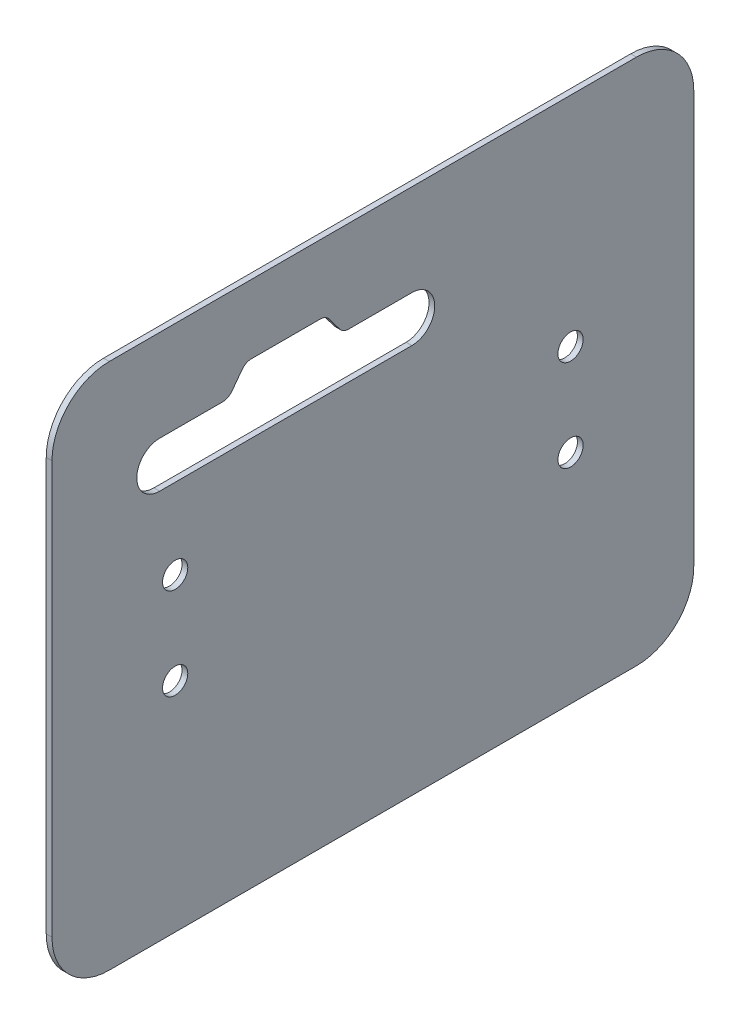
ISO-10303-21;
HEADER;
FILE_DESCRIPTION(('STEP AP214'),'2;1');
FILE_NAME('part.step','',(''),(''),'','','');
FILE_SCHEMA(('AUTOMOTIVE_DESIGN { 1 0 10303 214 1 1 1 1 }'));
ENDSEC;
DATA;
#1=APPLICATION_CONTEXT('core data for automotive mechanical design processes');
#2=APPLICATION_PROTOCOL_DEFINITION('international standard','automotive_design',2000,#1);
#3=PRODUCT_CONTEXT('',#1,'mechanical');
#4=PRODUCT('Part','Part','',(#3));
#5=PRODUCT_RELATED_PRODUCT_CATEGORY('part','',(#4));
#6=PRODUCT_DEFINITION_FORMATION('','',#4);
#7=PRODUCT_DEFINITION_CONTEXT('part definition',#1,'design');
#8=PRODUCT_DEFINITION('design','',#6,#7);
#9=PRODUCT_DEFINITION_SHAPE('','',#8);
#10=(LENGTH_UNIT() NAMED_UNIT(*) SI_UNIT(.MILLI.,.METRE.));
#11=(NAMED_UNIT(*) PLANE_ANGLE_UNIT() SI_UNIT($,.RADIAN.));
#12=(NAMED_UNIT(*) SI_UNIT($,.STERADIAN.) SOLID_ANGLE_UNIT());
#13=UNCERTAINTY_MEASURE_WITH_UNIT(LENGTH_MEASURE(1.E-05),#10,'distance_accuracy_value','');
#14=(GEOMETRIC_REPRESENTATION_CONTEXT(3) GLOBAL_UNCERTAINTY_ASSIGNED_CONTEXT((#13)) GLOBAL_UNIT_ASSIGNED_CONTEXT((#10,
#11,#12)) REPRESENTATION_CONTEXT('',''));
#15=CARTESIAN_POINT('',(0.,0.,0.));
#16=DIRECTION('',(0.,0.,1.));
#17=DIRECTION('',(1.,0.,0.));
#18=AXIS2_PLACEMENT_3D('',#15,#16,#17);
#19=CARTESIAN_POINT('',(0.5,18.,23.));
#20=DIRECTION('',(1.,0.,0.));
#21=DIRECTION('',(0.,0.,-1.));
#22=AXIS2_PLACEMENT_3D('',#19,#20,#21);
#23=PLANE('',#22);
#24=DIRECTION('',(0.,0.,-1.));
#25=VECTOR('',#24,1.);
#26=CARTESIAN_POINT('',(0.5,15.,0.));
#27=LINE('',#26,#25);
#28=CARTESIAN_POINT('',(0.5,15.,18.6));
#29=VERTEX_POINT('',#28);
#30=CARTESIAN_POINT('',(0.5,15.,13.1));
#31=VERTEX_POINT('',#30);
#32=EDGE_CURVE('E185',#29,#31,#27,.T.);
#33=ORIENTED_EDGE('',*,*,#32,.T.);
#34=CARTESIAN_POINT('',(0.5,16.,13.1));
#35=DIRECTION('',(1.,0.,0.));
#36=DIRECTION('',(0.,0.,-1.));
#37=AXIS2_PLACEMENT_3D('',#34,#35,#36);
#38=CIRCLE('',#37,1.);
#39=CARTESIAN_POINT('',(0.5,15.4,12.3));
#40=VERTEX_POINT('',#39);
#41=EDGE_CURVE('E332',#31,#40,#38,.T.);
#42=ORIENTED_EDGE('',*,*,#41,.T.);
#43=DIRECTION('',(0.,-0.8,0.6));
#44=VECTOR('',#43,1.);
#45=CARTESIAN_POINT('',(0.5,11.448,15.264));
#46=LINE('',#45,#44);
#47=CARTESIAN_POINT('',(0.5,16.6,11.4));
#48=VERTEX_POINT('',#47);
#49=EDGE_CURVE('E206',#48,#40,#46,.T.);
#50=ORIENTED_EDGE('',*,*,#49,.F.);
#51=CARTESIAN_POINT('',(0.5,16.,10.6));
#52=DIRECTION('',(1.,0.,0.));
#53=DIRECTION('',(0.,0.,-1.));
#54=AXIS2_PLACEMENT_3D('',#51,#52,#53);
#55=CIRCLE('',#54,1.);
#56=CARTESIAN_POINT('',(0.5,17.,10.6));
#57=VERTEX_POINT('',#56);
#58=EDGE_CURVE('E343',#48,#57,#55,.F.);
#59=ORIENTED_EDGE('',*,*,#58,.T.);
#60=DIRECTION('',(0.,0.,-1.));
#61=VECTOR('',#60,1.);
#62=CARTESIAN_POINT('',(0.5,17.,0.));
#63=LINE('',#62,#61);
#64=CARTESIAN_POINT('',(0.5,17.,4.6));
#65=VERTEX_POINT('',#64);
#66=EDGE_CURVE('E203',#57,#65,#63,.T.);
#67=ORIENTED_EDGE('',*,*,#66,.T.);
#68=CARTESIAN_POINT('',(0.5,16.,4.6));
#69=DIRECTION('',(1.,0.,0.));
#70=DIRECTION('',(0.,0.,-1.));
#71=AXIS2_PLACEMENT_3D('',#68,#69,#70);
#72=CIRCLE('',#71,1.);
#73=CARTESIAN_POINT('',(0.5,16.6,3.80000000000001));
#74=VERTEX_POINT('',#73);
#75=EDGE_CURVE('E42',#65,#74,#72,.F.);
#76=ORIENTED_EDGE('',*,*,#75,.T.);
#77=DIRECTION('',(0.,0.8,0.6));
#78=VECTOR('',#77,1.);
#79=CARTESIAN_POINT('',(0.5,4.15199999999999,-5.536));
#80=LINE('',#79,#78);
#81=CARTESIAN_POINT('',(0.5,15.4,2.90000000000001));
#82=VERTEX_POINT('',#81);
#83=EDGE_CURVE('E183',#82,#74,#80,.T.);
#84=ORIENTED_EDGE('',*,*,#83,.F.);
#85=CARTESIAN_POINT('',(0.5,16.,2.1));
#86=DIRECTION('',(1.,0.,0.));
#87=DIRECTION('',(0.,0.,-1.));
#88=AXIS2_PLACEMENT_3D('',#85,#86,#87);
#89=CIRCLE('',#88,1.);
#90=CARTESIAN_POINT('',(0.5,15.,2.1));
#91=VERTEX_POINT('',#90);
#92=EDGE_CURVE('E180',#82,#91,#89,.T.);
#93=ORIENTED_EDGE('',*,*,#92,.T.);
#94=CARTESIAN_POINT('',(0.5,15.,-3.4));
#95=VERTEX_POINT('',#94);
#96=EDGE_CURVE('E172',#91,#95,#27,.T.);
#97=ORIENTED_EDGE('',*,*,#96,.T.);
#98=CARTESIAN_POINT('',(0.5,13.,-3.4));
#99=DIRECTION('',(1.,0.,0.));
#100=DIRECTION('',(0.,0.,-1.));
#101=AXIS2_PLACEMENT_3D('',#98,#99,#100);
#102=CIRCLE('',#101,2.);
#103=CARTESIAN_POINT('',(0.5,11.,-3.4));
#104=VERTEX_POINT('',#103);
#105=EDGE_CURVE('E178',#104,#95,#102,.T.);
#106=ORIENTED_EDGE('',*,*,#105,.F.);
#107=DIRECTION('',(0.,0.,-1.));
#108=VECTOR('',#107,1.);
#109=CARTESIAN_POINT('',(0.5,11.,0.));
#110=LINE('',#109,#108);
#111=CARTESIAN_POINT('',(0.5,11.,18.6));
#112=VERTEX_POINT('',#111);
#113=EDGE_CURVE('E198',#112,#104,#110,.T.);
#114=ORIENTED_EDGE('',*,*,#113,.F.);
#115=CARTESIAN_POINT('',(0.5,13.,18.6));
#116=DIRECTION('',(1.,0.,0.));
#117=DIRECTION('',(0.,0.,-1.));
#118=AXIS2_PLACEMENT_3D('',#115,#116,#117);
#119=CIRCLE('',#118,2.);
#120=EDGE_CURVE('E209',#29,#112,#119,.T.);
#121=ORIENTED_EDGE('',*,*,#120,.F.);
#122=EDGE_LOOP('',(#33,#42,#50,#59,#67,#76,#84,#93,#97,#106,#114,#121));
#123=FACE_BOUND('',#122,.T.);
#124=CARTESIAN_POINT('',(0.5,-4.00000000000001,17.25));
#125=DIRECTION('',(1.,0.,0.));
#126=DIRECTION('',(0.,0.,-1.));
#127=AXIS2_PLACEMENT_3D('',#124,#125,#126);
#128=CIRCLE('',#127,1.1);
#129=CARTESIAN_POINT('',(0.5,-4.00000000000001,16.15));
#130=VERTEX_POINT('',#129);
#131=EDGE_CURVE('E223',#130,#130,#128,.T.);
#132=ORIENTED_EDGE('',*,*,#131,.F.);
#133=EDGE_LOOP('',(#132));
#134=FACE_BOUND('',#133,.T.);
#135=CARTESIAN_POINT('',(0.5,4.,-17.25));
#136=DIRECTION('',(1.,0.,0.));
#137=DIRECTION('',(0.,0.,-1.));
#138=AXIS2_PLACEMENT_3D('',#135,#136,#137);
#139=CIRCLE('',#138,1.1);
#140=CARTESIAN_POINT('',(0.5,4.,-18.35));
#141=VERTEX_POINT('',#140);
#142=EDGE_CURVE('E235',#141,#141,#139,.T.);
#143=ORIENTED_EDGE('',*,*,#142,.F.);
#144=EDGE_LOOP('',(#143));
#145=FACE_BOUND('',#144,.T.);
#146=CARTESIAN_POINT('',(0.5,18.,23.));
#147=DIRECTION('',(1.,0.,0.));
#148=DIRECTION('',(0.,0.,-1.));
#149=AXIS2_PLACEMENT_3D('',#146,#147,#148);
#150=CIRCLE('',#149,5.00000000000001);
#151=CARTESIAN_POINT('',(0.5,23.,23.));
#152=VERTEX_POINT('',#151);
#153=CARTESIAN_POINT('',(0.5,18.,28.));
#154=VERTEX_POINT('',#153);
#155=EDGE_CURVE('E241',#152,#154,#150,.T.);
#156=ORIENTED_EDGE('',*,*,#155,.T.);
#157=DIRECTION('',(0.,-1.,0.));
#158=VECTOR('',#157,1.);
#159=CARTESIAN_POINT('',(0.5,18.,28.));
#160=LINE('',#159,#158);
#161=CARTESIAN_POINT('',(0.5,-18.,28.));
#162=VERTEX_POINT('',#161);
#163=EDGE_CURVE('E244',#154,#162,#160,.T.);
#164=ORIENTED_EDGE('',*,*,#163,.T.);
#165=CARTESIAN_POINT('',(0.5,-18.,23.));
#166=DIRECTION('',(1.,0.,0.));
#167=DIRECTION('',(0.,0.,-1.));
#168=AXIS2_PLACEMENT_3D('',#165,#166,#167);
#169=CIRCLE('',#168,5.);
#170=CARTESIAN_POINT('',(0.5,-23.,23.));
#171=VERTEX_POINT('',#170);
#172=EDGE_CURVE('E247',#162,#171,#169,.T.);
#173=ORIENTED_EDGE('',*,*,#172,.T.);
#174=DIRECTION('',(0.,0.,-1.));
#175=VECTOR('',#174,1.);
#176=CARTESIAN_POINT('',(0.5,-23.,23.));
#177=LINE('',#176,#175);
#178=CARTESIAN_POINT('',(0.5,-23.,-23.));
#179=VERTEX_POINT('',#178);
#180=EDGE_CURVE('E249',#171,#179,#177,.T.);
#181=ORIENTED_EDGE('',*,*,#180,.T.);
#182=CARTESIAN_POINT('',(0.5,-18.,-23.));
#183=DIRECTION('',(1.,0.,0.));
#184=DIRECTION('',(0.,0.,-1.));
#185=AXIS2_PLACEMENT_3D('',#182,#183,#184);
#186=CIRCLE('',#185,5.);
#187=CARTESIAN_POINT('',(0.5,-18.,-28.));
#188=VERTEX_POINT('',#187);
#189=EDGE_CURVE('E251',#179,#188,#186,.T.);
#190=ORIENTED_EDGE('',*,*,#189,.T.);
#191=DIRECTION('',(0.,1.,0.));
#192=VECTOR('',#191,1.);
#193=CARTESIAN_POINT('',(0.5,18.,-28.));
#194=LINE('',#193,#192);
#195=CARTESIAN_POINT('',(0.5,18.,-28.));
#196=VERTEX_POINT('',#195);
#197=EDGE_CURVE('E253',#188,#196,#194,.T.);
#198=ORIENTED_EDGE('',*,*,#197,.T.);
#199=CARTESIAN_POINT('',(0.5,18.,-23.));
#200=DIRECTION('',(1.,0.,0.));
#201=DIRECTION('',(0.,0.,1.));
#202=AXIS2_PLACEMENT_3D('',#199,#200,#201);
#203=CIRCLE('',#202,5.00000000000001);
#204=CARTESIAN_POINT('',(0.5,23.,-23.));
#205=VERTEX_POINT('',#204);
#206=EDGE_CURVE('E255',#196,#205,#203,.T.);
#207=ORIENTED_EDGE('',*,*,#206,.T.);
#208=DIRECTION('',(0.,0.,1.));
#209=VECTOR('',#208,1.);
#210=CARTESIAN_POINT('',(0.5,23.,23.));
#211=LINE('',#210,#209);
#212=EDGE_CURVE('E257',#205,#152,#211,.T.);
#213=ORIENTED_EDGE('',*,*,#212,.T.);
#214=EDGE_LOOP('',(#156,#164,#173,#181,#190,#198,#207,#213));
#215=FACE_BOUND('',#214,.T.);
#216=CARTESIAN_POINT('',(0.5,-4.,-17.25));
#217=DIRECTION('',(1.,0.,0.));
#218=DIRECTION('',(0.,0.,-1.));
#219=AXIS2_PLACEMENT_3D('',#216,#217,#218);
#220=CIRCLE('',#219,1.1);
#221=CARTESIAN_POINT('',(0.5,-4.,-18.35));
#222=VERTEX_POINT('',#221);
#223=EDGE_CURVE('E229',#222,#222,#220,.T.);
#224=ORIENTED_EDGE('',*,*,#223,.F.);
#225=EDGE_LOOP('',(#224));
#226=FACE_BOUND('',#225,.T.);
#227=CARTESIAN_POINT('',(0.5,3.99999999999999,17.25));
#228=DIRECTION('',(1.,0.,0.));
#229=DIRECTION('',(0.,0.,-1.));
#230=AXIS2_PLACEMENT_3D('',#227,#228,#229);
#231=CIRCLE('',#230,1.1);
#232=CARTESIAN_POINT('',(0.5,3.99999999999999,16.15));
#233=VERTEX_POINT('',#232);
#234=EDGE_CURVE('E217',#233,#233,#231,.T.);
#235=ORIENTED_EDGE('',*,*,#234,.F.);
#236=EDGE_LOOP('',(#235));
#237=FACE_BOUND('',#236,.T.);
#238=ADVANCED_FACE('F34',(#123,#134,#145,#215,#226,#237),#23,.T.);
#239=CARTESIAN_POINT('',(0.,18.,23.));
#240=DIRECTION('',(1.,0.,0.));
#241=DIRECTION('',(0.,0.,-1.));
#242=AXIS2_PLACEMENT_3D('',#239,#240,#241);
#243=PLANE('',#242);
#244=DIRECTION('',(0.,-0.8,0.6));
#245=VECTOR('',#244,1.);
#246=CARTESIAN_POINT('',(0.,11.928,14.904));
#247=LINE('',#246,#245);
#248=CARTESIAN_POINT('',(0.,16.6,11.4));
#249=VERTEX_POINT('',#248);
#250=CARTESIAN_POINT('',(0.,15.4,12.3));
#251=VERTEX_POINT('',#250);
#252=EDGE_CURVE('E306',#249,#251,#247,.T.);
#253=ORIENTED_EDGE('',*,*,#252,.T.);
#254=CARTESIAN_POINT('',(0.,16.,13.1));
#255=DIRECTION('',(1.,0.,0.));
#256=DIRECTION('',(0.,0.,-1.));
#257=AXIS2_PLACEMENT_3D('',#254,#255,#256);
#258=CIRCLE('',#257,1.);
#259=CARTESIAN_POINT('',(0.,15.,13.1));
#260=VERTEX_POINT('',#259);
#261=EDGE_CURVE('E335',#251,#260,#258,.F.);
#262=ORIENTED_EDGE('',*,*,#261,.T.);
#263=DIRECTION('',(0.,0.,-1.));
#264=VECTOR('',#263,1.);
#265=CARTESIAN_POINT('',(0.,15.,23.));
#266=LINE('',#265,#264);
#267=CARTESIAN_POINT('',(0.,15.,18.6));
#268=VERTEX_POINT('',#267);
#269=EDGE_CURVE('E309',#268,#260,#266,.T.);
#270=ORIENTED_EDGE('',*,*,#269,.F.);
#271=CARTESIAN_POINT('',(0.,13.,18.6));
#272=DIRECTION('',(1.,0.,0.));
#273=DIRECTION('',(0.,0.,-1.));
#274=AXIS2_PLACEMENT_3D('',#271,#272,#273);
#275=CIRCLE('',#274,2.);
#276=CARTESIAN_POINT('',(0.,11.,18.6));
#277=VERTEX_POINT('',#276);
#278=EDGE_CURVE('E312',#268,#277,#275,.T.);
#279=ORIENTED_EDGE('',*,*,#278,.T.);
#280=DIRECTION('',(0.,0.,-1.));
#281=VECTOR('',#280,1.);
#282=CARTESIAN_POINT('',(0.,11.,23.));
#283=LINE('',#282,#281);
#284=CARTESIAN_POINT('',(0.,11.,-3.4));
#285=VERTEX_POINT('',#284);
#286=EDGE_CURVE('E315',#277,#285,#283,.T.);
#287=ORIENTED_EDGE('',*,*,#286,.T.);
#288=CARTESIAN_POINT('',(0.,13.,-3.4));
#289=DIRECTION('',(1.,0.,0.));
#290=DIRECTION('',(0.,0.,-1.));
#291=AXIS2_PLACEMENT_3D('',#288,#289,#290);
#292=CIRCLE('',#291,2.);
#293=CARTESIAN_POINT('',(0.,15.,-3.4));
#294=VERTEX_POINT('',#293);
#295=EDGE_CURVE('E298',#285,#294,#292,.T.);
#296=ORIENTED_EDGE('',*,*,#295,.T.);
#297=DIRECTION('',(0.,0.,-1.));
#298=VECTOR('',#297,1.);
#299=CARTESIAN_POINT('',(0.,15.,23.));
#300=LINE('',#299,#298);
#301=CARTESIAN_POINT('',(0.,15.,2.1));
#302=VERTEX_POINT('',#301);
#303=EDGE_CURVE('E189',#302,#294,#300,.T.);
#304=ORIENTED_EDGE('',*,*,#303,.F.);
#305=CARTESIAN_POINT('',(0.,16.,2.1));
#306=DIRECTION('',(1.,0.,0.));
#307=DIRECTION('',(0.,0.,-1.));
#308=AXIS2_PLACEMENT_3D('',#305,#306,#307);
#309=CIRCLE('',#308,1.);
#310=CARTESIAN_POINT('',(0.,15.4,2.9));
#311=VERTEX_POINT('',#310);
#312=EDGE_CURVE('E56',#302,#311,#309,.F.);
#313=ORIENTED_EDGE('',*,*,#312,.T.);
#314=DIRECTION('',(0.,0.8,0.6));
#315=VECTOR('',#314,1.);
#316=CARTESIAN_POINT('',(0.,26.712,11.384));
#317=LINE('',#316,#315);
#318=CARTESIAN_POINT('',(0.,16.6,3.8));
#319=VERTEX_POINT('',#318);
#320=EDGE_CURVE('E301',#311,#319,#317,.T.);
#321=ORIENTED_EDGE('',*,*,#320,.T.);
#322=CARTESIAN_POINT('',(0.,16.,4.6));
#323=DIRECTION('',(1.,0.,0.));
#324=DIRECTION('',(0.,0.,-1.));
#325=AXIS2_PLACEMENT_3D('',#322,#323,#324);
#326=CIRCLE('',#325,1.);
#327=CARTESIAN_POINT('',(0.,17.,4.6));
#328=VERTEX_POINT('',#327);
#329=EDGE_CURVE('E11',#319,#328,#326,.T.);
#330=ORIENTED_EDGE('',*,*,#329,.T.);
#331=DIRECTION('',(0.,0.,-1.));
#332=VECTOR('',#331,1.);
#333=CARTESIAN_POINT('',(0.,17.,23.));
#334=LINE('',#333,#332);
#335=CARTESIAN_POINT('',(0.,17.,10.6));
#336=VERTEX_POINT('',#335);
#337=EDGE_CURVE('E303',#336,#328,#334,.T.);
#338=ORIENTED_EDGE('',*,*,#337,.F.);
#339=CARTESIAN_POINT('',(0.,16.,10.6));
#340=DIRECTION('',(1.,0.,0.));
#341=DIRECTION('',(0.,0.,-1.));
#342=AXIS2_PLACEMENT_3D('',#339,#340,#341);
#343=CIRCLE('',#342,1.);
#344=EDGE_CURVE('E345',#336,#249,#343,.T.);
#345=ORIENTED_EDGE('',*,*,#344,.T.);
#346=EDGE_LOOP('',(#253,#262,#270,#279,#287,#296,#304,#313,#321,#330,#338,#345));
#347=FACE_BOUND('',#346,.T.);
#348=CARTESIAN_POINT('',(0.,18.,23.));
#349=DIRECTION('',(1.,0.,0.));
#350=DIRECTION('',(0.,0.,-1.));
#351=AXIS2_PLACEMENT_3D('',#348,#349,#350);
#352=CIRCLE('',#351,5.00000000000001);
#353=CARTESIAN_POINT('',(0.,23.,23.));
#354=VERTEX_POINT('',#353);
#355=CARTESIAN_POINT('',(0.,18.,28.));
#356=VERTEX_POINT('',#355);
#357=EDGE_CURVE('E238',#354,#356,#352,.T.);
#358=ORIENTED_EDGE('',*,*,#357,.F.);
#359=DIRECTION('',(0.,0.,1.));
#360=VECTOR('',#359,1.);
#361=CARTESIAN_POINT('',(0.,23.,23.));
#362=LINE('',#361,#360);
#363=CARTESIAN_POINT('',(0.,23.,-23.));
#364=VERTEX_POINT('',#363);
#365=EDGE_CURVE('E245',#364,#354,#362,.T.);
#366=ORIENTED_EDGE('',*,*,#365,.F.);
#367=CARTESIAN_POINT('',(0.,18.,-23.));
#368=DIRECTION('',(1.,0.,0.));
#369=DIRECTION('',(0.,0.,1.));
#370=AXIS2_PLACEMENT_3D('',#367,#368,#369);
#371=CIRCLE('',#370,5.00000000000001);
#372=CARTESIAN_POINT('',(0.,18.,-28.));
#373=VERTEX_POINT('',#372);
#374=EDGE_CURVE('E272',#373,#364,#371,.T.);
#375=ORIENTED_EDGE('',*,*,#374,.F.);
#376=DIRECTION('',(0.,1.,0.));
#377=VECTOR('',#376,1.);
#378=CARTESIAN_POINT('',(0.,18.,-28.));
#379=LINE('',#378,#377);
#380=CARTESIAN_POINT('',(0.,-18.,-28.));
#381=VERTEX_POINT('',#380);
#382=EDGE_CURVE('E270',#381,#373,#379,.T.);
#383=ORIENTED_EDGE('',*,*,#382,.F.);
#384=CARTESIAN_POINT('',(0.,-18.,-23.));
#385=DIRECTION('',(1.,0.,0.));
#386=DIRECTION('',(0.,0.,-1.));
#387=AXIS2_PLACEMENT_3D('',#384,#385,#386);
#388=CIRCLE('',#387,5.);
#389=CARTESIAN_POINT('',(0.,-23.,-23.));
#390=VERTEX_POINT('',#389);
#391=EDGE_CURVE('E268',#390,#381,#388,.T.);
#392=ORIENTED_EDGE('',*,*,#391,.F.);
#393=DIRECTION('',(0.,0.,-1.));
#394=VECTOR('',#393,1.);
#395=CARTESIAN_POINT('',(0.,-23.,23.));
#396=LINE('',#395,#394);
#397=CARTESIAN_POINT('',(0.,-23.,23.));
#398=VERTEX_POINT('',#397);
#399=EDGE_CURVE('E266',#398,#390,#396,.T.);
#400=ORIENTED_EDGE('',*,*,#399,.F.);
#401=CARTESIAN_POINT('',(0.,-18.,23.));
#402=DIRECTION('',(1.,0.,0.));
#403=DIRECTION('',(0.,0.,-1.));
#404=AXIS2_PLACEMENT_3D('',#401,#402,#403);
#405=CIRCLE('',#404,5.);
#406=CARTESIAN_POINT('',(0.,-18.,28.));
#407=VERTEX_POINT('',#406);
#408=EDGE_CURVE('E264',#407,#398,#405,.T.);
#409=ORIENTED_EDGE('',*,*,#408,.F.);
#410=DIRECTION('',(0.,-1.,0.));
#411=VECTOR('',#410,1.);
#412=CARTESIAN_POINT('',(0.,18.,28.));
#413=LINE('',#412,#411);
#414=EDGE_CURVE('E262',#356,#407,#413,.T.);
#415=ORIENTED_EDGE('',*,*,#414,.F.);
#416=EDGE_LOOP('',(#358,#366,#375,#383,#392,#400,#409,#415));
#417=FACE_BOUND('',#416,.T.);
#418=CARTESIAN_POINT('',(0.,4.,-17.25));
#419=DIRECTION('',(1.,0.,0.));
#420=DIRECTION('',(0.,0.,-1.));
#421=AXIS2_PLACEMENT_3D('',#418,#419,#420);
#422=CIRCLE('',#421,1.1);
#423=CARTESIAN_POINT('',(0.,4.,-18.35));
#424=VERTEX_POINT('',#423);
#425=EDGE_CURVE('E232',#424,#424,#422,.T.);
#426=ORIENTED_EDGE('',*,*,#425,.T.);
#427=EDGE_LOOP('',(#426));
#428=FACE_BOUND('',#427,.T.);
#429=CARTESIAN_POINT('',(0.,-4.,-17.25));
#430=DIRECTION('',(1.,0.,0.));
#431=DIRECTION('',(0.,0.,-1.));
#432=AXIS2_PLACEMENT_3D('',#429,#430,#431);
#433=CIRCLE('',#432,1.1);
#434=CARTESIAN_POINT('',(0.,-4.,-18.35));
#435=VERTEX_POINT('',#434);
#436=EDGE_CURVE('E226',#435,#435,#433,.T.);
#437=ORIENTED_EDGE('',*,*,#436,.T.);
#438=EDGE_LOOP('',(#437));
#439=FACE_BOUND('',#438,.T.);
#440=CARTESIAN_POINT('',(0.,-4.00000000000001,17.25));
#441=DIRECTION('',(1.,0.,0.));
#442=DIRECTION('',(0.,0.,-1.));
#443=AXIS2_PLACEMENT_3D('',#440,#441,#442);
#444=CIRCLE('',#443,1.1);
#445=CARTESIAN_POINT('',(0.,-4.00000000000001,16.15));
#446=VERTEX_POINT('',#445);
#447=EDGE_CURVE('E220',#446,#446,#444,.T.);
#448=ORIENTED_EDGE('',*,*,#447,.T.);
#449=EDGE_LOOP('',(#448));
#450=FACE_BOUND('',#449,.T.);
#451=CARTESIAN_POINT('',(0.,3.99999999999999,17.25));
#452=DIRECTION('',(1.,0.,0.));
#453=DIRECTION('',(0.,0.,-1.));
#454=AXIS2_PLACEMENT_3D('',#451,#452,#453);
#455=CIRCLE('',#454,1.1);
#456=CARTESIAN_POINT('',(0.,3.99999999999999,16.15));
#457=VERTEX_POINT('',#456);
#458=EDGE_CURVE('E214',#457,#457,#455,.T.);
#459=ORIENTED_EDGE('',*,*,#458,.T.);
#460=EDGE_LOOP('',(#459));
#461=FACE_BOUND('',#460,.T.);
#462=ADVANCED_FACE('F354',(#347,#417,#428,#439,#450,#461),#243,.F.);
#463=CARTESIAN_POINT('',(0.5,18.,23.));
#464=DIRECTION('',(-1.,0.,0.));
#465=DIRECTION('',(0.,0.,1.));
#466=AXIS2_PLACEMENT_3D('',#463,#464,#465);
#467=CYLINDRICAL_SURFACE('',#466,5.00000000000001);
#468=ORIENTED_EDGE('',*,*,#357,.T.);
#469=DIRECTION('',(-1.,0.,0.));
#470=VECTOR('',#469,1.);
#471=CARTESIAN_POINT('',(0.5,18.,28.));
#472=LINE('',#471,#470);
#473=EDGE_CURVE('E295',#154,#356,#472,.T.);
#474=ORIENTED_EDGE('',*,*,#473,.F.);
#475=ORIENTED_EDGE('',*,*,#155,.F.);
#476=DIRECTION('',(-1.,0.,0.));
#477=VECTOR('',#476,1.);
#478=CARTESIAN_POINT('',(0.5,23.,23.));
#479=LINE('',#478,#477);
#480=EDGE_CURVE('E259',#152,#354,#479,.T.);
#481=ORIENTED_EDGE('',*,*,#480,.T.);
#482=EDGE_LOOP('',(#468,#474,#475,#481));
#483=FACE_BOUND('',#482,.T.);
#484=ADVANCED_FACE('F400',(#483),#467,.T.);
#485=CARTESIAN_POINT('',(0.5,18.,28.));
#486=DIRECTION('',(0.,0.,-1.));
#487=DIRECTION('',(0.,1.,0.));
#488=AXIS2_PLACEMENT_3D('',#485,#486,#487);
#489=PLANE('',#488);
#490=ORIENTED_EDGE('',*,*,#414,.T.);
#491=DIRECTION('',(-1.,0.,0.));
#492=VECTOR('',#491,1.);
#493=CARTESIAN_POINT('',(0.5,-18.,28.));
#494=LINE('',#493,#492);
#495=EDGE_CURVE('E292',#162,#407,#494,.T.);
#496=ORIENTED_EDGE('',*,*,#495,.F.);
#497=ORIENTED_EDGE('',*,*,#163,.F.);
#498=ORIENTED_EDGE('',*,*,#473,.T.);
#499=EDGE_LOOP('',(#490,#496,#497,#498));
#500=FACE_BOUND('',#499,.T.);
#501=ADVANCED_FACE('F429',(#500),#489,.F.);
#502=CARTESIAN_POINT('',(0.5,-18.,23.));
#503=DIRECTION('',(-1.,0.,0.));
#504=DIRECTION('',(0.,0.,1.));
#505=AXIS2_PLACEMENT_3D('',#502,#503,#504);
#506=CYLINDRICAL_SURFACE('',#505,5.);
#507=ORIENTED_EDGE('',*,*,#408,.T.);
#508=DIRECTION('',(-1.,0.,0.));
#509=VECTOR('',#508,1.);
#510=CARTESIAN_POINT('',(0.5,-23.,23.));
#511=LINE('',#510,#509);
#512=EDGE_CURVE('E289',#171,#398,#511,.T.);
#513=ORIENTED_EDGE('',*,*,#512,.F.);
#514=ORIENTED_EDGE('',*,*,#172,.F.);
#515=ORIENTED_EDGE('',*,*,#495,.T.);
#516=EDGE_LOOP('',(#507,#513,#514,#515));
#517=FACE_BOUND('',#516,.T.);
#518=ADVANCED_FACE('F425',(#517),#506,.T.);
#519=CARTESIAN_POINT('',(0.5,-23.,23.));
#520=DIRECTION('',(0.,1.,0.));
#521=DIRECTION('',(0.,0.,1.));
#522=AXIS2_PLACEMENT_3D('',#519,#520,#521);
#523=PLANE('',#522);
#524=ORIENTED_EDGE('',*,*,#399,.T.);
#525=DIRECTION('',(-1.,0.,0.));
#526=VECTOR('',#525,1.);
#527=CARTESIAN_POINT('',(0.5,-23.,-23.));
#528=LINE('',#527,#526);
#529=EDGE_CURVE('E286',#179,#390,#528,.T.);
#530=ORIENTED_EDGE('',*,*,#529,.F.);
#531=ORIENTED_EDGE('',*,*,#180,.F.);
#532=ORIENTED_EDGE('',*,*,#512,.T.);
#533=EDGE_LOOP('',(#524,#530,#531,#532));
#534=FACE_BOUND('',#533,.T.);
#535=ADVANCED_FACE('F421',(#534),#523,.F.);
#536=CARTESIAN_POINT('',(0.5,-18.,-23.));
#537=DIRECTION('',(-1.,0.,0.));
#538=DIRECTION('',(0.,0.,1.));
#539=AXIS2_PLACEMENT_3D('',#536,#537,#538);
#540=CYLINDRICAL_SURFACE('',#539,5.);
#541=ORIENTED_EDGE('',*,*,#391,.T.);
#542=DIRECTION('',(-1.,0.,0.));
#543=VECTOR('',#542,1.);
#544=CARTESIAN_POINT('',(0.5,-18.,-28.));
#545=LINE('',#544,#543);
#546=EDGE_CURVE('E283',#188,#381,#545,.T.);
#547=ORIENTED_EDGE('',*,*,#546,.F.);
#548=ORIENTED_EDGE('',*,*,#189,.F.);
#549=ORIENTED_EDGE('',*,*,#529,.T.);
#550=EDGE_LOOP('',(#541,#547,#548,#549));
#551=FACE_BOUND('',#550,.T.);
#552=ADVANCED_FACE('F417',(#551),#540,.T.);
#553=CARTESIAN_POINT('',(0.5,18.,-28.));
#554=DIRECTION('',(0.,0.,1.));
#555=DIRECTION('',(1.,0.,0.));
#556=AXIS2_PLACEMENT_3D('',#553,#554,#555);
#557=PLANE('',#556);
#558=ORIENTED_EDGE('',*,*,#382,.T.);
#559=DIRECTION('',(-1.,0.,0.));
#560=VECTOR('',#559,1.);
#561=CARTESIAN_POINT('',(0.5,18.,-28.));
#562=LINE('',#561,#560);
#563=EDGE_CURVE('E280',#196,#373,#562,.T.);
#564=ORIENTED_EDGE('',*,*,#563,.F.);
#565=ORIENTED_EDGE('',*,*,#197,.F.);
#566=ORIENTED_EDGE('',*,*,#546,.T.);
#567=EDGE_LOOP('',(#558,#564,#565,#566));
#568=FACE_BOUND('',#567,.T.);
#569=ADVANCED_FACE('F413',(#568),#557,.F.);
#570=CARTESIAN_POINT('',(0.5,18.,-23.));
#571=DIRECTION('',(-1.,0.,0.));
#572=DIRECTION('',(0.,0.,1.));
#573=AXIS2_PLACEMENT_3D('',#570,#571,#572);
#574=CYLINDRICAL_SURFACE('',#573,5.00000000000001);
#575=ORIENTED_EDGE('',*,*,#374,.T.);
#576=DIRECTION('',(-1.,0.,0.));
#577=VECTOR('',#576,1.);
#578=CARTESIAN_POINT('',(0.5,23.,-23.));
#579=LINE('',#578,#577);
#580=EDGE_CURVE('E277',#205,#364,#579,.T.);
#581=ORIENTED_EDGE('',*,*,#580,.F.);
#582=ORIENTED_EDGE('',*,*,#206,.F.);
#583=ORIENTED_EDGE('',*,*,#563,.T.);
#584=EDGE_LOOP('',(#575,#581,#582,#583));
#585=FACE_BOUND('',#584,.T.);
#586=ADVANCED_FACE('F409',(#585),#574,.T.);
#587=CARTESIAN_POINT('',(0.5,23.,23.));
#588=DIRECTION('',(0.,-1.,0.));
#589=DIRECTION('',(0.,0.,-1.));
#590=AXIS2_PLACEMENT_3D('',#587,#588,#589);
#591=PLANE('',#590);
#592=ORIENTED_EDGE('',*,*,#365,.T.);
#593=ORIENTED_EDGE('',*,*,#480,.F.);
#594=ORIENTED_EDGE('',*,*,#212,.F.);
#595=ORIENTED_EDGE('',*,*,#580,.T.);
#596=EDGE_LOOP('',(#592,#593,#594,#595));
#597=FACE_BOUND('',#596,.T.);
#598=ADVANCED_FACE('F406',(#597),#591,.F.);
#599=CARTESIAN_POINT('',(0.5,4.,-17.25));
#600=DIRECTION('',(-1.,0.,0.));
#601=DIRECTION('',(0.,0.,1.));
#602=AXIS2_PLACEMENT_3D('',#599,#600,#601);
#603=CYLINDRICAL_SURFACE('',#602,1.1);
#604=ORIENTED_EDGE('',*,*,#142,.T.);
#605=EDGE_LOOP('',(#604));
#606=FACE_BOUND('',#605,.T.);
#607=ORIENTED_EDGE('',*,*,#425,.F.);
#608=EDGE_LOOP('',(#607));
#609=FACE_BOUND('',#608,.T.);
#610=ADVANCED_FACE('F403',(#606,#609),#603,.F.);
#611=CARTESIAN_POINT('',(0.5,-4.,-17.25));
#612=DIRECTION('',(-1.,0.,0.));
#613=DIRECTION('',(0.,0.,1.));
#614=AXIS2_PLACEMENT_3D('',#611,#612,#613);
#615=CYLINDRICAL_SURFACE('',#614,1.1);
#616=ORIENTED_EDGE('',*,*,#223,.T.);
#617=EDGE_LOOP('',(#616));
#618=FACE_BOUND('',#617,.T.);
#619=ORIENTED_EDGE('',*,*,#436,.F.);
#620=EDGE_LOOP('',(#619));
#621=FACE_BOUND('',#620,.T.);
#622=ADVANCED_FACE('F545',(#618,#621),#615,.F.);
#623=CARTESIAN_POINT('',(0.5,-4.00000000000001,17.25));
#624=DIRECTION('',(-1.,0.,0.));
#625=DIRECTION('',(0.,0.,1.));
#626=AXIS2_PLACEMENT_3D('',#623,#624,#625);
#627=CYLINDRICAL_SURFACE('',#626,1.1);
#628=ORIENTED_EDGE('',*,*,#131,.T.);
#629=EDGE_LOOP('',(#628));
#630=FACE_BOUND('',#629,.T.);
#631=ORIENTED_EDGE('',*,*,#447,.F.);
#632=EDGE_LOOP('',(#631));
#633=FACE_BOUND('',#632,.T.);
#634=ADVANCED_FACE('F391',(#630,#633),#627,.F.);
#635=CARTESIAN_POINT('',(0.5,3.99999999999999,17.25));
#636=DIRECTION('',(-1.,0.,0.));
#637=DIRECTION('',(0.,0.,1.));
#638=AXIS2_PLACEMENT_3D('',#635,#636,#637);
#639=CYLINDRICAL_SURFACE('',#638,1.1);
#640=ORIENTED_EDGE('',*,*,#234,.T.);
#641=EDGE_LOOP('',(#640));
#642=FACE_BOUND('',#641,.T.);
#643=ORIENTED_EDGE('',*,*,#458,.F.);
#644=EDGE_LOOP('',(#643));
#645=FACE_BOUND('',#644,.T.);
#646=ADVANCED_FACE('F384',(#642,#645),#639,.F.);
#647=CARTESIAN_POINT('',(-9.5,11.,0.));
#648=DIRECTION('',(0.,-1.,0.));
#649=DIRECTION('',(0.,0.,-1.));
#650=AXIS2_PLACEMENT_3D('',#647,#648,#649);
#651=PLANE('',#650);
#652=DIRECTION('',(1.,0.,0.));
#653=VECTOR('',#652,1.);
#654=CARTESIAN_POINT('',(-9.5,11.,18.6));
#655=LINE('',#654,#653);
#656=EDGE_CURVE('E212',#277,#112,#655,.T.);
#657=ORIENTED_EDGE('',*,*,#656,.T.);
#658=ORIENTED_EDGE('',*,*,#113,.T.);
#659=DIRECTION('',(1.,0.,0.));
#660=VECTOR('',#659,1.);
#661=CARTESIAN_POINT('',(-9.5,11.,-3.4));
#662=LINE('',#661,#660);
#663=EDGE_CURVE('E193',#285,#104,#662,.T.);
#664=ORIENTED_EDGE('',*,*,#663,.F.);
#665=ORIENTED_EDGE('',*,*,#286,.F.);
#666=EDGE_LOOP('',(#657,#658,#664,#665));
#667=FACE_BOUND('',#666,.T.);
#668=ADVANCED_FACE('F382',(#667),#651,.F.);
#669=CARTESIAN_POINT('',(-9.5,13.,18.6));
#670=DIRECTION('',(1.,0.,0.));
#671=DIRECTION('',(0.,0.,-1.));
#672=AXIS2_PLACEMENT_3D('',#669,#670,#671);
#673=CYLINDRICAL_SURFACE('',#672,2.);
#674=DIRECTION('',(1.,0.,0.));
#675=VECTOR('',#674,1.);
#676=CARTESIAN_POINT('',(-9.5,15.,18.6));
#677=LINE('',#676,#675);
#678=EDGE_CURVE('E192',#268,#29,#677,.T.);
#679=ORIENTED_EDGE('',*,*,#678,.T.);
#680=ORIENTED_EDGE('',*,*,#120,.T.);
#681=ORIENTED_EDGE('',*,*,#656,.F.);
#682=ORIENTED_EDGE('',*,*,#278,.F.);
#683=EDGE_LOOP('',(#679,#680,#681,#682));
#684=FACE_BOUND('',#683,.T.);
#685=ADVANCED_FACE('F379',(#684),#673,.F.);
#686=CARTESIAN_POINT('',(-9.5,15.,0.));
#687=DIRECTION('',(0.,-1.,0.));
#688=DIRECTION('',(0.,0.,-1.));
#689=AXIS2_PLACEMENT_3D('',#686,#687,#688);
#690=PLANE('',#689);
#691=ORIENTED_EDGE('',*,*,#269,.T.);
#692=DIRECTION('',(1.,0.,0.));
#693=VECTOR('',#692,1.);
#694=CARTESIAN_POINT('',(0.499999999999997,15.,13.1));
#695=LINE('',#694,#693);
#696=EDGE_CURVE('E328',#260,#31,#695,.T.);
#697=ORIENTED_EDGE('',*,*,#696,.T.);
#698=ORIENTED_EDGE('',*,*,#32,.F.);
#699=ORIENTED_EDGE('',*,*,#678,.F.);
#700=EDGE_LOOP('',(#691,#697,#698,#699));
#701=FACE_BOUND('',#700,.T.);
#702=ADVANCED_FACE('F375',(#701),#690,.T.);
#703=CARTESIAN_POINT('',(-9.5,11.448,15.264));
#704=DIRECTION('',(0.,0.6,0.8));
#705=DIRECTION('',(0.,-0.8,0.6));
#706=AXIS2_PLACEMENT_3D('',#703,#704,#705);
#707=PLANE('',#706);
#708=ORIENTED_EDGE('',*,*,#252,.F.);
#709=DIRECTION('',(1.,0.,0.));
#710=VECTOR('',#709,1.);
#711=CARTESIAN_POINT('',(-9.5,16.6,11.4));
#712=LINE('',#711,#710);
#713=EDGE_CURVE('E320',#249,#48,#712,.T.);
#714=ORIENTED_EDGE('',*,*,#713,.T.);
#715=ORIENTED_EDGE('',*,*,#49,.T.);
#716=DIRECTION('',(1.,0.,0.));
#717=VECTOR('',#716,1.);
#718=CARTESIAN_POINT('',(0.,15.4,12.3));
#719=LINE('',#718,#717);
#720=EDGE_CURVE('E318',#40,#251,#719,.F.);
#721=ORIENTED_EDGE('',*,*,#720,.T.);
#722=EDGE_LOOP('',(#708,#714,#715,#721));
#723=FACE_BOUND('',#722,.T.);
#724=ADVANCED_FACE('F366',(#723),#707,.F.);
#725=CARTESIAN_POINT('',(-9.5,17.,0.));
#726=DIRECTION('',(0.,-1.,0.));
#727=DIRECTION('',(0.,0.,-1.));
#728=AXIS2_PLACEMENT_3D('',#725,#726,#727);
#729=PLANE('',#728);
#730=ORIENTED_EDGE('',*,*,#66,.F.);
#731=DIRECTION('',(1.,0.,0.));
#732=VECTOR('',#731,1.);
#733=CARTESIAN_POINT('',(-9.5,17.,10.6));
#734=LINE('',#733,#732);
#735=EDGE_CURVE('E326',#57,#336,#734,.F.);
#736=ORIENTED_EDGE('',*,*,#735,.T.);
#737=ORIENTED_EDGE('',*,*,#337,.T.);
#738=DIRECTION('',(1.,0.,0.));
#739=VECTOR('',#738,1.);
#740=CARTESIAN_POINT('',(-9.5,17.,4.6));
#741=LINE('',#740,#739);
#742=EDGE_CURVE('E323',#328,#65,#741,.T.);
#743=ORIENTED_EDGE('',*,*,#742,.T.);
#744=EDGE_LOOP('',(#730,#736,#737,#743));
#745=FACE_BOUND('',#744,.T.);
#746=ADVANCED_FACE('F358',(#745),#729,.T.);
#747=CARTESIAN_POINT('',(-9.5,4.15199999999999,-5.536));
#748=DIRECTION('',(0.,0.6,-0.8));
#749=DIRECTION('',(0.,0.8,0.6));
#750=AXIS2_PLACEMENT_3D('',#747,#748,#749);
#751=PLANE('',#750);
#752=ORIENTED_EDGE('',*,*,#83,.T.);
#753=DIRECTION('',(1.,0.,0.));
#754=VECTOR('',#753,1.);
#755=CARTESIAN_POINT('',(-9.5,16.6,3.8));
#756=LINE('',#755,#754);
#757=EDGE_CURVE('E49',#74,#319,#756,.F.);
#758=ORIENTED_EDGE('',*,*,#757,.T.);
#759=ORIENTED_EDGE('',*,*,#320,.F.);
#760=DIRECTION('',(1.,0.,0.));
#761=VECTOR('',#760,1.);
#762=CARTESIAN_POINT('',(0.499999999999997,15.4,2.9));
#763=LINE('',#762,#761);
#764=EDGE_CURVE('E337',#311,#82,#763,.T.);
#765=ORIENTED_EDGE('',*,*,#764,.T.);
#766=EDGE_LOOP('',(#752,#758,#759,#765));
#767=FACE_BOUND('',#766,.T.);
#768=ADVANCED_FACE('F349',(#767),#751,.F.);
#769=ORIENTED_EDGE('',*,*,#96,.F.);
#770=DIRECTION('',(1.,0.,0.));
#771=VECTOR('',#770,1.);
#772=CARTESIAN_POINT('',(0.,15.,2.1));
#773=LINE('',#772,#771);
#774=EDGE_CURVE('E341',#91,#302,#773,.F.);
#775=ORIENTED_EDGE('',*,*,#774,.T.);
#776=ORIENTED_EDGE('',*,*,#303,.T.);
#777=DIRECTION('',(1.,0.,0.));
#778=VECTOR('',#777,1.);
#779=CARTESIAN_POINT('',(-9.5,15.,-3.4));
#780=LINE('',#779,#778);
#781=EDGE_CURVE('E187',#294,#95,#780,.T.);
#782=ORIENTED_EDGE('',*,*,#781,.T.);
#783=EDGE_LOOP('',(#769,#775,#776,#782));
#784=FACE_BOUND('',#783,.T.);
#785=ADVANCED_FACE('F188',(#784),#690,.T.);
#786=CARTESIAN_POINT('',(-9.5,13.,-3.4));
#787=DIRECTION('',(1.,0.,0.));
#788=DIRECTION('',(0.,0.,-1.));
#789=AXIS2_PLACEMENT_3D('',#786,#787,#788);
#790=CYLINDRICAL_SURFACE('',#789,2.);
#791=ORIENTED_EDGE('',*,*,#663,.T.);
#792=ORIENTED_EDGE('',*,*,#105,.T.);
#793=ORIENTED_EDGE('',*,*,#781,.F.);
#794=ORIENTED_EDGE('',*,*,#295,.F.);
#795=EDGE_LOOP('',(#791,#792,#793,#794));
#796=FACE_BOUND('',#795,.T.);
#797=ADVANCED_FACE('F196',(#796),#790,.F.);
#798=CARTESIAN_POINT('',(-9.5,16.,10.6));
#799=DIRECTION('',(1.,0.,0.));
#800=DIRECTION('',(0.,0.,-1.));
#801=AXIS2_PLACEMENT_3D('',#798,#799,#800);
#802=CYLINDRICAL_SURFACE('',#801,1.);
#803=ORIENTED_EDGE('',*,*,#344,.F.);
#804=ORIENTED_EDGE('',*,*,#735,.F.);
#805=ORIENTED_EDGE('',*,*,#58,.F.);
#806=ORIENTED_EDGE('',*,*,#713,.F.);
#807=EDGE_LOOP('',(#803,#804,#805,#806));
#808=FACE_BOUND('',#807,.T.);
#809=ADVANCED_FACE('F361',(#808),#802,.F.);
#810=CARTESIAN_POINT('',(-9.5,16.,13.1));
#811=DIRECTION('',(-1.,0.,0.));
#812=DIRECTION('',(0.,0.,1.));
#813=AXIS2_PLACEMENT_3D('',#810,#811,#812);
#814=CYLINDRICAL_SURFACE('',#813,1.);
#815=ORIENTED_EDGE('',*,*,#261,.F.);
#816=ORIENTED_EDGE('',*,*,#720,.F.);
#817=ORIENTED_EDGE('',*,*,#41,.F.);
#818=ORIENTED_EDGE('',*,*,#696,.F.);
#819=EDGE_LOOP('',(#815,#816,#817,#818));
#820=FACE_BOUND('',#819,.T.);
#821=ADVANCED_FACE('F370',(#820),#814,.T.);
#822=CARTESIAN_POINT('',(-9.5,16.,4.6));
#823=DIRECTION('',(1.,0.,0.));
#824=DIRECTION('',(0.,0.,-1.));
#825=AXIS2_PLACEMENT_3D('',#822,#823,#824);
#826=CYLINDRICAL_SURFACE('',#825,1.);
#827=ORIENTED_EDGE('',*,*,#329,.F.);
#828=ORIENTED_EDGE('',*,*,#757,.F.);
#829=ORIENTED_EDGE('',*,*,#75,.F.);
#830=ORIENTED_EDGE('',*,*,#742,.F.);
#831=EDGE_LOOP('',(#827,#828,#829,#830));
#832=FACE_BOUND('',#831,.T.);
#833=ADVANCED_FACE('F352',(#832),#826,.F.);
#834=CARTESIAN_POINT('',(-9.5,16.,2.1));
#835=DIRECTION('',(-1.,0.,0.));
#836=DIRECTION('',(0.,0.,1.));
#837=AXIS2_PLACEMENT_3D('',#834,#835,#836);
#838=CYLINDRICAL_SURFACE('',#837,1.);
#839=ORIENTED_EDGE('',*,*,#312,.F.);
#840=ORIENTED_EDGE('',*,*,#774,.F.);
#841=ORIENTED_EDGE('',*,*,#92,.F.);
#842=ORIENTED_EDGE('',*,*,#764,.F.);
#843=EDGE_LOOP('',(#839,#840,#841,#842));
#844=FACE_BOUND('',#843,.T.);
#845=ADVANCED_FACE('F36',(#844),#838,.T.);
#846=CLOSED_SHELL('',(#238,#462,#484,#501,#518,#535,#552,#569,#586,#598,#610,#622,#634,#646,
#668,#685,#702,#724,#746,#768,#785,#797,#809,#821,#833,#845));
#847=MANIFOLD_SOLID_BREP('B2',#846);
#848=ADVANCED_BREP_SHAPE_REPRESENTATION('',(#18,#847),#14);
#849=SHAPE_DEFINITION_REPRESENTATION(#9,#848);
ENDSEC;
END-ISO-10303-21;
